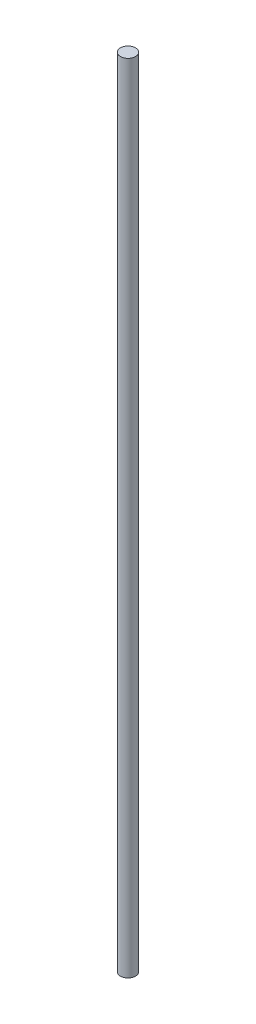
ISO-10303-21;
HEADER;
FILE_DESCRIPTION(('STEP AP214'),'2;1');
FILE_NAME('part.step','',(''),(''),'','','');
FILE_SCHEMA(('AUTOMOTIVE_DESIGN { 1 0 10303 214 1 1 1 1 }'));
ENDSEC;
DATA;
#1=APPLICATION_CONTEXT('core data for automotive mechanical design processes');
#2=APPLICATION_PROTOCOL_DEFINITION('international standard','automotive_design',2000,#1);
#3=PRODUCT_CONTEXT('',#1,'mechanical');
#4=PRODUCT('Part','Part','',(#3));
#5=PRODUCT_RELATED_PRODUCT_CATEGORY('part','',(#4));
#6=PRODUCT_DEFINITION_FORMATION('','',#4);
#7=PRODUCT_DEFINITION_CONTEXT('part definition',#1,'design');
#8=PRODUCT_DEFINITION('design','',#6,#7);
#9=PRODUCT_DEFINITION_SHAPE('','',#8);
#10=(LENGTH_UNIT() NAMED_UNIT(*) SI_UNIT(.MILLI.,.METRE.));
#11=(NAMED_UNIT(*) PLANE_ANGLE_UNIT() SI_UNIT($,.RADIAN.));
#12=(NAMED_UNIT(*) SI_UNIT($,.STERADIAN.) SOLID_ANGLE_UNIT());
#13=UNCERTAINTY_MEASURE_WITH_UNIT(LENGTH_MEASURE(1.E-05),#10,'distance_accuracy_value','');
#14=(GEOMETRIC_REPRESENTATION_CONTEXT(3) GLOBAL_UNCERTAINTY_ASSIGNED_CONTEXT((#13)) GLOBAL_UNIT_ASSIGNED_CONTEXT((#10,
#11,#12)) REPRESENTATION_CONTEXT('',''));
#15=CARTESIAN_POINT('',(0.,0.,0.));
#16=DIRECTION('',(0.,0.,1.));
#17=DIRECTION('',(1.,0.,0.));
#18=AXIS2_PLACEMENT_3D('',#15,#16,#17);
#19=CARTESIAN_POINT('',(0.,500.,0.));
#20=DIRECTION('',(0.,-1.,0.));
#21=DIRECTION('',(0.,0.,-1.));
#22=AXIS2_PLACEMENT_3D('',#19,#20,#21);
#23=CYLINDRICAL_SURFACE('',#22,4.75);
#24=CARTESIAN_POINT('',(0.,500.,0.));
#25=DIRECTION('',(0.,1.,0.));
#26=DIRECTION('',(0.,0.,1.));
#27=AXIS2_PLACEMENT_3D('',#24,#25,#26);
#28=CIRCLE('',#27,4.75);
#29=CARTESIAN_POINT('',(0.,500.,4.75));
#30=VERTEX_POINT('',#29);
#31=EDGE_CURVE('E10',#30,#30,#28,.T.);
#32=ORIENTED_EDGE('',*,*,#31,.F.);
#33=EDGE_LOOP('',(#32));
#34=FACE_BOUND('',#33,.T.);
#35=CARTESIAN_POINT('',(0.,0.,0.));
#36=DIRECTION('',(0.,1.,0.));
#37=DIRECTION('',(0.,0.,1.));
#38=AXIS2_PLACEMENT_3D('',#35,#36,#37);
#39=CIRCLE('',#38,4.75);
#40=CARTESIAN_POINT('',(0.,0.,4.75));
#41=VERTEX_POINT('',#40);
#42=EDGE_CURVE('E40',#41,#41,#39,.T.);
#43=ORIENTED_EDGE('',*,*,#42,.T.);
#44=EDGE_LOOP('',(#43));
#45=FACE_BOUND('',#44,.T.);
#46=ADVANCED_FACE('F37',(#34,#45),#23,.T.);
#47=CARTESIAN_POINT('',(0.,500.,0.));
#48=DIRECTION('',(0.,1.,0.));
#49=DIRECTION('',(0.,0.,1.));
#50=AXIS2_PLACEMENT_3D('',#47,#48,#49);
#51=PLANE('',#50);
#52=ORIENTED_EDGE('',*,*,#31,.T.);
#53=EDGE_LOOP('',(#52));
#54=FACE_BOUND('',#53,.T.);
#55=ADVANCED_FACE('F54',(#54),#51,.T.);
#56=CARTESIAN_POINT('',(0.,0.,0.));
#57=DIRECTION('',(0.,1.,0.));
#58=DIRECTION('',(0.,0.,1.));
#59=AXIS2_PLACEMENT_3D('',#56,#57,#58);
#60=PLANE('',#59);
#61=ORIENTED_EDGE('',*,*,#42,.F.);
#62=EDGE_LOOP('',(#61));
#63=FACE_BOUND('',#62,.T.);
#64=ADVANCED_FACE('F52',(#63),#60,.F.);
#65=CLOSED_SHELL('',(#46,#55,#64));
#66=MANIFOLD_SOLID_BREP('B2',#65);
#67=ADVANCED_BREP_SHAPE_REPRESENTATION('',(#18,#66),#14);
#68=SHAPE_DEFINITION_REPRESENTATION(#9,#67);
ENDSEC;
END-ISO-10303-21;
